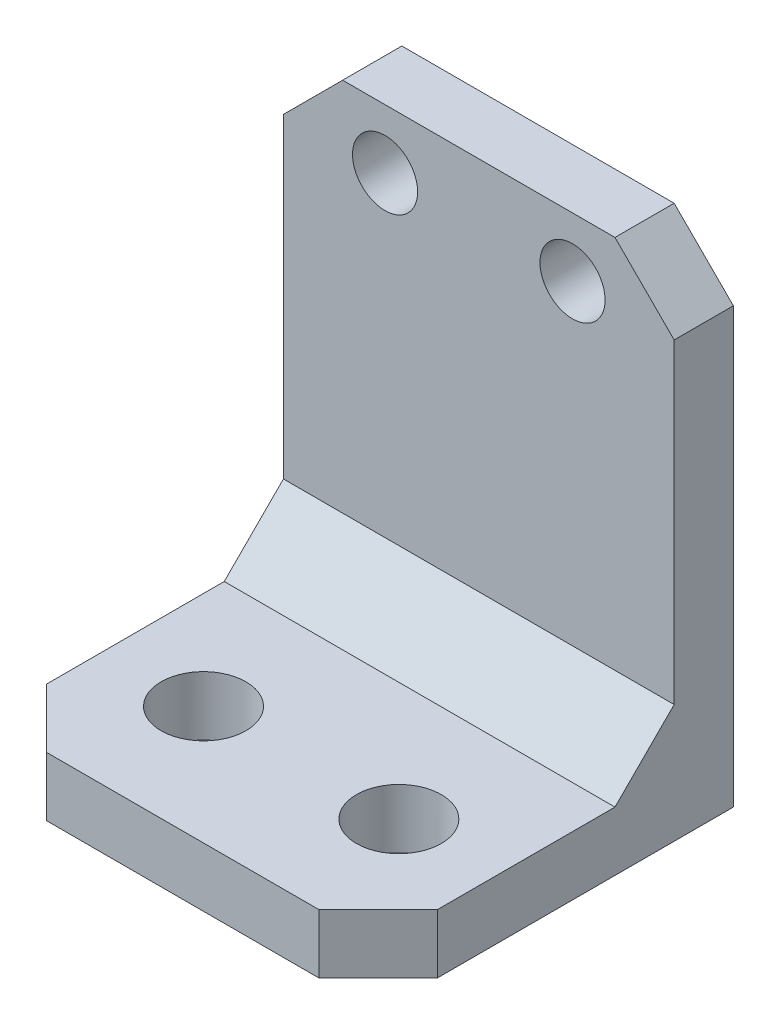
ISO-10303-21;
HEADER;
FILE_DESCRIPTION(('STEP AP214'),'2;1');
FILE_NAME('part.step','',(''),(''),'','','');
FILE_SCHEMA(('AUTOMOTIVE_DESIGN { 1 0 10303 214 1 1 1 1 }'));
ENDSEC;
DATA;
#1=APPLICATION_CONTEXT('core data for automotive mechanical design processes');
#2=APPLICATION_PROTOCOL_DEFINITION('international standard','automotive_design',2000,#1);
#3=PRODUCT_CONTEXT('',#1,'mechanical');
#4=PRODUCT('Part','Part','',(#3));
#5=PRODUCT_RELATED_PRODUCT_CATEGORY('part','',(#4));
#6=PRODUCT_DEFINITION_FORMATION('','',#4);
#7=PRODUCT_DEFINITION_CONTEXT('part definition',#1,'design');
#8=PRODUCT_DEFINITION('design','',#6,#7);
#9=PRODUCT_DEFINITION_SHAPE('','',#8);
#10=(LENGTH_UNIT() NAMED_UNIT(*) SI_UNIT(.MILLI.,.METRE.));
#11=(NAMED_UNIT(*) PLANE_ANGLE_UNIT() SI_UNIT($,.RADIAN.));
#12=(NAMED_UNIT(*) SI_UNIT($,.STERADIAN.) SOLID_ANGLE_UNIT());
#13=UNCERTAINTY_MEASURE_WITH_UNIT(LENGTH_MEASURE(1.E-05),#10,'distance_accuracy_value','');
#14=(GEOMETRIC_REPRESENTATION_CONTEXT(3) GLOBAL_UNCERTAINTY_ASSIGNED_CONTEXT((#13)) GLOBAL_UNIT_ASSIGNED_CONTEXT((#10,
#11,#12)) REPRESENTATION_CONTEXT('',''));
#15=CARTESIAN_POINT('',(0.,0.,0.));
#16=DIRECTION('',(0.,0.,1.));
#17=DIRECTION('',(1.,0.,0.));
#18=AXIS2_PLACEMENT_3D('',#15,#16,#17);
#19=CARTESIAN_POINT('',(0.,0.,3.));
#20=DIRECTION('',(0.,0.,-1.));
#21=DIRECTION('',(-1.,0.,0.));
#22=AXIS2_PLACEMENT_3D('',#19,#20,#21);
#23=PLANE('',#22);
#24=CARTESIAN_POINT('',(4.75,10.7876712328767,3.));
#25=DIRECTION('',(0.,0.,1.));
#26=DIRECTION('',(-1.,0.,0.));
#27=AXIS2_PLACEMENT_3D('',#24,#25,#26);
#28=CIRCLE('',#27,1.65);
#29=CARTESIAN_POINT('',(3.1,10.7876712328767,3.));
#30=VERTEX_POINT('',#29);
#31=EDGE_CURVE('E281',#30,#30,#28,.T.);
#32=ORIENTED_EDGE('',*,*,#31,.F.);
#33=EDGE_LOOP('',(#32));
#34=FACE_BOUND('',#33,.T.);
#35=CARTESIAN_POINT('',(-4.75,10.7876712328767,3.));
#36=DIRECTION('',(0.,0.,1.));
#37=DIRECTION('',(1.,0.,0.));
#38=AXIS2_PLACEMENT_3D('',#35,#36,#37);
#39=CIRCLE('',#38,1.65);
#40=CARTESIAN_POINT('',(-3.1,10.7876712328767,3.));
#41=VERTEX_POINT('',#40);
#42=EDGE_CURVE('E273',#41,#41,#39,.T.);
#43=ORIENTED_EDGE('',*,*,#42,.F.);
#44=EDGE_LOOP('',(#43));
#45=FACE_BOUND('',#44,.T.);
#46=DIRECTION('',(0.,1.,0.));
#47=VECTOR('',#46,1.);
#48=CARTESIAN_POINT('',(9.90000000000001,-11.2123287671233,3.));
#49=LINE('',#48,#47);
#50=CARTESIAN_POINT('',(9.90000000000001,-5.2123287671233,3.));
#51=VERTEX_POINT('',#50);
#52=CARTESIAN_POINT('',(9.9,10.7876712328767,3.));
#53=VERTEX_POINT('',#52);
#54=EDGE_CURVE('E146',#51,#53,#49,.T.);
#55=ORIENTED_EDGE('',*,*,#54,.T.);
#56=DIRECTION('',(0.707106781186547,-0.707106781186548,0.));
#57=VECTOR('',#56,1.);
#58=CARTESIAN_POINT('',(6.9,13.7876712328767,3.));
#59=LINE('',#58,#57);
#60=CARTESIAN_POINT('',(6.89999999999999,13.7876712328767,3.));
#61=VERTEX_POINT('',#60);
#62=EDGE_CURVE('E169',#53,#61,#59,.F.);
#63=ORIENTED_EDGE('',*,*,#62,.T.);
#64=DIRECTION('',(-1.,0.,0.));
#65=VECTOR('',#64,1.);
#66=CARTESIAN_POINT('',(-9.9,13.7876712328767,3.));
#67=LINE('',#66,#65);
#68=CARTESIAN_POINT('',(-6.89999999999999,13.7876712328767,3.));
#69=VERTEX_POINT('',#68);
#70=EDGE_CURVE('E149',#61,#69,#67,.T.);
#71=ORIENTED_EDGE('',*,*,#70,.T.);
#72=DIRECTION('',(0.707106781186549,0.707106781186546,0.));
#73=VECTOR('',#72,1.);
#74=CARTESIAN_POINT('',(-9.9,10.7876712328767,3.));
#75=LINE('',#74,#73);
#76=CARTESIAN_POINT('',(-9.9,10.7876712328767,3.));
#77=VERTEX_POINT('',#76);
#78=EDGE_CURVE('E167',#69,#77,#75,.F.);
#79=ORIENTED_EDGE('',*,*,#78,.T.);
#80=DIRECTION('',(0.,-1.,0.));
#81=VECTOR('',#80,1.);
#82=CARTESIAN_POINT('',(-9.9,-11.2123287671233,3.));
#83=LINE('',#82,#81);
#84=CARTESIAN_POINT('',(-9.9,-5.2123287671233,3.));
#85=VERTEX_POINT('',#84);
#86=EDGE_CURVE('E153',#77,#85,#83,.T.);
#87=ORIENTED_EDGE('',*,*,#86,.T.);
#88=DIRECTION('',(1.,0.,0.));
#89=VECTOR('',#88,1.);
#90=CARTESIAN_POINT('',(9.90000000000001,-5.2123287671233,3.));
#91=LINE('',#90,#89);
#92=EDGE_CURVE('E165',#85,#51,#91,.T.);
#93=ORIENTED_EDGE('',*,*,#92,.T.);
#94=EDGE_LOOP('',(#55,#63,#71,#79,#87,#93));
#95=FACE_BOUND('',#94,.T.);
#96=ADVANCED_FACE('F37',(#34,#45,#95),#23,.F.);
#97=CARTESIAN_POINT('',(0.,0.,0.));
#98=DIRECTION('',(0.,0.,-1.));
#99=DIRECTION('',(-1.,0.,0.));
#100=AXIS2_PLACEMENT_3D('',#97,#98,#99);
#101=PLANE('',#100);
#102=CARTESIAN_POINT('',(-4.75,10.7876712328767,0.));
#103=DIRECTION('',(0.,0.,1.));
#104=DIRECTION('',(1.,0.,0.));
#105=AXIS2_PLACEMENT_3D('',#102,#103,#104);
#106=CIRCLE('',#105,1.65);
#107=CARTESIAN_POINT('',(-3.1,10.7876712328767,0.));
#108=VERTEX_POINT('',#107);
#109=EDGE_CURVE('E278',#108,#108,#106,.T.);
#110=ORIENTED_EDGE('',*,*,#109,.T.);
#111=EDGE_LOOP('',(#110));
#112=FACE_BOUND('',#111,.T.);
#113=DIRECTION('',(-1.,0.,0.));
#114=VECTOR('',#113,1.);
#115=CARTESIAN_POINT('',(-9.9,13.7876712328767,0.));
#116=LINE('',#115,#114);
#117=CARTESIAN_POINT('',(6.89999999999999,13.7876712328767,0.));
#118=VERTEX_POINT('',#117);
#119=CARTESIAN_POINT('',(-6.89999999999999,13.7876712328767,0.));
#120=VERTEX_POINT('',#119);
#121=EDGE_CURVE('E139',#118,#120,#116,.T.);
#122=ORIENTED_EDGE('',*,*,#121,.F.);
#123=DIRECTION('',(-0.707106781186547,0.707106781186548,0.));
#124=VECTOR('',#123,1.);
#125=CARTESIAN_POINT('',(10.3438356164384,10.3438356164383,0.));
#126=LINE('',#125,#124);
#127=CARTESIAN_POINT('',(9.9,10.7876712328767,0.));
#128=VERTEX_POINT('',#127);
#129=EDGE_CURVE('E161',#118,#128,#126,.F.);
#130=ORIENTED_EDGE('',*,*,#129,.T.);
#131=DIRECTION('',(0.,1.,0.));
#132=VECTOR('',#131,1.);
#133=CARTESIAN_POINT('',(9.90000000000001,-11.2123287671233,0.));
#134=LINE('',#133,#132);
#135=CARTESIAN_POINT('',(9.90000000000001,-11.2123287671233,0.));
#136=VERTEX_POINT('',#135);
#137=EDGE_CURVE('E145',#136,#128,#134,.T.);
#138=ORIENTED_EDGE('',*,*,#137,.F.);
#139=DIRECTION('',(1.,0.,0.));
#140=VECTOR('',#139,1.);
#141=CARTESIAN_POINT('',(-9.9,-11.2123287671233,0.));
#142=LINE('',#141,#140);
#143=CARTESIAN_POINT('',(-9.9,-11.2123287671233,0.));
#144=VERTEX_POINT('',#143);
#145=EDGE_CURVE('E125',#144,#136,#142,.T.);
#146=ORIENTED_EDGE('',*,*,#145,.F.);
#147=DIRECTION('',(0.,-1.,0.));
#148=VECTOR('',#147,1.);
#149=CARTESIAN_POINT('',(-9.9,-11.2123287671233,0.));
#150=LINE('',#149,#148);
#151=CARTESIAN_POINT('',(-9.9,10.7876712328767,0.));
#152=VERTEX_POINT('',#151);
#153=EDGE_CURVE('E133',#152,#144,#150,.T.);
#154=ORIENTED_EDGE('',*,*,#153,.F.);
#155=DIRECTION('',(-0.707106781186549,-0.707106781186546,0.));
#156=VECTOR('',#155,1.);
#157=CARTESIAN_POINT('',(-10.3438356164383,10.3438356164384,0.));
#158=LINE('',#157,#156);
#159=EDGE_CURVE('E159',#152,#120,#158,.F.);
#160=ORIENTED_EDGE('',*,*,#159,.T.);
#161=EDGE_LOOP('',(#122,#130,#138,#146,#154,#160));
#162=FACE_BOUND('',#161,.T.);
#163=CARTESIAN_POINT('',(4.75,10.7876712328767,0.));
#164=DIRECTION('',(0.,0.,1.));
#165=DIRECTION('',(-1.,0.,0.));
#166=AXIS2_PLACEMENT_3D('',#163,#164,#165);
#167=CIRCLE('',#166,1.65);
#168=CARTESIAN_POINT('',(3.1,10.7876712328767,0.));
#169=VERTEX_POINT('',#168);
#170=EDGE_CURVE('E284',#169,#169,#167,.T.);
#171=ORIENTED_EDGE('',*,*,#170,.T.);
#172=EDGE_LOOP('',(#171));
#173=FACE_BOUND('',#172,.T.);
#174=ADVANCED_FACE('F142',(#112,#162,#173),#101,.T.);
#175=CARTESIAN_POINT('',(9.90000000000001,-11.2123287671233,3.));
#176=DIRECTION('',(-1.,0.,0.));
#177=DIRECTION('',(0.,-1.,0.));
#178=AXIS2_PLACEMENT_3D('',#175,#176,#177);
#179=PLANE('',#178);
#180=DIRECTION('',(0.,0.,-1.));
#181=VECTOR('',#180,1.);
#182=CARTESIAN_POINT('',(9.90000000000001,-8.21232876712329,18.));
#183=LINE('',#182,#181);
#184=CARTESIAN_POINT('',(9.90000000000001,-8.21232876712329,15.));
#185=VERTEX_POINT('',#184);
#186=CARTESIAN_POINT('',(9.90000000000001,-8.21232876712329,6.00000000000002));
#187=VERTEX_POINT('',#186);
#188=EDGE_CURVE('E262',#185,#187,#183,.T.);
#189=ORIENTED_EDGE('',*,*,#188,.F.);
#190=DIRECTION('',(0.,-1.,0.));
#191=VECTOR('',#190,1.);
#192=CARTESIAN_POINT('',(9.90000000000001,-11.2123287671233,15.));
#193=LINE('',#192,#191);
#194=CARTESIAN_POINT('',(9.90000000000001,-11.2123287671233,15.));
#195=VERTEX_POINT('',#194);
#196=EDGE_CURVE('E11',#185,#195,#193,.T.);
#197=ORIENTED_EDGE('',*,*,#196,.T.);
#198=DIRECTION('',(0.,0.,-1.));
#199=VECTOR('',#198,1.);
#200=CARTESIAN_POINT('',(9.90000000000001,-11.2123287671233,3.));
#201=LINE('',#200,#199);
#202=EDGE_CURVE('E129',#195,#136,#201,.T.);
#203=ORIENTED_EDGE('',*,*,#202,.T.);
#204=ORIENTED_EDGE('',*,*,#137,.T.);
#205=DIRECTION('',(0.,0.,1.));
#206=VECTOR('',#205,1.);
#207=CARTESIAN_POINT('',(9.9,10.7876712328767,3.));
#208=LINE('',#207,#206);
#209=EDGE_CURVE('E163',#128,#53,#208,.T.);
#210=ORIENTED_EDGE('',*,*,#209,.T.);
#211=ORIENTED_EDGE('',*,*,#54,.F.);
#212=DIRECTION('',(0.,0.707106781186544,-0.707106781186551));
#213=VECTOR('',#212,1.);
#214=CARTESIAN_POINT('',(9.90000000000001,-8.21232876712326,5.99999999999999));
#215=LINE('',#214,#213);
#216=EDGE_CURVE('E177',#51,#187,#215,.F.);
#217=ORIENTED_EDGE('',*,*,#216,.T.);
#218=EDGE_LOOP('',(#189,#197,#203,#204,#210,#211,#217));
#219=FACE_BOUND('',#218,.T.);
#220=ADVANCED_FACE('F221',(#219),#179,.F.);
#221=CARTESIAN_POINT('',(-9.9,13.7876712328767,3.));
#222=DIRECTION('',(0.,-1.,0.));
#223=DIRECTION('',(0.,0.,-1.));
#224=AXIS2_PLACEMENT_3D('',#221,#222,#223);
#225=PLANE('',#224);
#226=ORIENTED_EDGE('',*,*,#70,.F.);
#227=DIRECTION('',(0.,0.,-1.));
#228=VECTOR('',#227,1.);
#229=CARTESIAN_POINT('',(6.9,13.7876712328767,3.));
#230=LINE('',#229,#228);
#231=EDGE_CURVE('E156',#61,#118,#230,.T.);
#232=ORIENTED_EDGE('',*,*,#231,.T.);
#233=ORIENTED_EDGE('',*,*,#121,.T.);
#234=DIRECTION('',(0.,0.,1.));
#235=VECTOR('',#234,1.);
#236=CARTESIAN_POINT('',(-6.89999999999999,13.7876712328767,3.));
#237=LINE('',#236,#235);
#238=EDGE_CURVE('E128',#120,#69,#237,.T.);
#239=ORIENTED_EDGE('',*,*,#238,.T.);
#240=EDGE_LOOP('',(#226,#232,#233,#239));
#241=FACE_BOUND('',#240,.T.);
#242=ADVANCED_FACE('F235',(#241),#225,.F.);
#243=CARTESIAN_POINT('',(-9.9,-11.2123287671233,3.));
#244=DIRECTION('',(1.,0.,0.));
#245=DIRECTION('',(0.,1.,0.));
#246=AXIS2_PLACEMENT_3D('',#243,#244,#245);
#247=PLANE('',#246);
#248=DIRECTION('',(0.,0.,-1.));
#249=VECTOR('',#248,1.);
#250=CARTESIAN_POINT('',(-9.9,-11.2123287671233,3.));
#251=LINE('',#250,#249);
#252=CARTESIAN_POINT('',(-9.9,-11.2123287671233,15.));
#253=VERTEX_POINT('',#252);
#254=EDGE_CURVE('E119',#253,#144,#251,.T.);
#255=ORIENTED_EDGE('',*,*,#254,.F.);
#256=DIRECTION('',(0.,1.,0.));
#257=VECTOR('',#256,1.);
#258=CARTESIAN_POINT('',(-9.9,-11.2123287671233,15.));
#259=LINE('',#258,#257);
#260=CARTESIAN_POINT('',(-9.9,-8.21232876712329,15.));
#261=VERTEX_POINT('',#260);
#262=EDGE_CURVE('E60',#253,#261,#259,.T.);
#263=ORIENTED_EDGE('',*,*,#262,.T.);
#264=DIRECTION('',(0.,0.,-1.));
#265=VECTOR('',#264,1.);
#266=CARTESIAN_POINT('',(-9.9,-8.21232876712329,18.));
#267=LINE('',#266,#265);
#268=CARTESIAN_POINT('',(-9.9,-8.21232876712329,6.00000000000002));
#269=VERTEX_POINT('',#268);
#270=EDGE_CURVE('E194',#261,#269,#267,.T.);
#271=ORIENTED_EDGE('',*,*,#270,.T.);
#272=DIRECTION('',(0.,-0.707106781186544,0.707106781186551));
#273=VECTOR('',#272,1.);
#274=CARTESIAN_POINT('',(-9.9,-8.21232876712327,5.99999999999999));
#275=LINE('',#274,#273);
#276=EDGE_CURVE('E175',#269,#85,#275,.F.);
#277=ORIENTED_EDGE('',*,*,#276,.T.);
#278=ORIENTED_EDGE('',*,*,#86,.F.);
#279=DIRECTION('',(0.,0.,-1.));
#280=VECTOR('',#279,1.);
#281=CARTESIAN_POINT('',(-9.9,10.7876712328767,3.));
#282=LINE('',#281,#280);
#283=EDGE_CURVE('E137',#77,#152,#282,.T.);
#284=ORIENTED_EDGE('',*,*,#283,.T.);
#285=ORIENTED_EDGE('',*,*,#153,.T.);
#286=EDGE_LOOP('',(#255,#263,#271,#277,#278,#284,#285));
#287=FACE_BOUND('',#286,.T.);
#288=ADVANCED_FACE('F134',(#287),#247,.F.);
#289=CARTESIAN_POINT('',(-9.9,-11.2123287671233,3.));
#290=DIRECTION('',(0.,1.,0.));
#291=DIRECTION('',(-1.,0.,0.));
#292=AXIS2_PLACEMENT_3D('',#289,#290,#291);
#293=PLANE('',#292);
#294=CARTESIAN_POINT('',(4.95000000000001,-11.2123287671233,12.));
#295=DIRECTION('',(0.,1.,0.));
#296=DIRECTION('',(-1.,0.,0.));
#297=AXIS2_PLACEMENT_3D('',#294,#295,#296);
#298=CIRCLE('',#297,2.15);
#299=CARTESIAN_POINT('',(2.80000000000001,-11.2123287671233,12.));
#300=VERTEX_POINT('',#299);
#301=EDGE_CURVE('E292',#300,#300,#298,.T.);
#302=ORIENTED_EDGE('',*,*,#301,.T.);
#303=EDGE_LOOP('',(#302));
#304=FACE_BOUND('',#303,.T.);
#305=CARTESIAN_POINT('',(-4.94999999999999,-11.2123287671233,12.));
#306=DIRECTION('',(0.,1.,0.));
#307=DIRECTION('',(-1.,0.,0.));
#308=AXIS2_PLACEMENT_3D('',#305,#306,#307);
#309=CIRCLE('',#308,2.15);
#310=CARTESIAN_POINT('',(-7.09999999999999,-11.2123287671233,12.));
#311=VERTEX_POINT('',#310);
#312=EDGE_CURVE('E295',#311,#311,#309,.T.);
#313=ORIENTED_EDGE('',*,*,#312,.T.);
#314=EDGE_LOOP('',(#313));
#315=FACE_BOUND('',#314,.T.);
#316=DIRECTION('',(1.,0.,0.));
#317=VECTOR('',#316,1.);
#318=CARTESIAN_POINT('',(-9.9,-11.2123287671233,18.));
#319=LINE('',#318,#317);
#320=CARTESIAN_POINT('',(-6.9,-11.2123287671233,18.));
#321=VERTEX_POINT('',#320);
#322=CARTESIAN_POINT('',(6.90000000000001,-11.2123287671233,18.));
#323=VERTEX_POINT('',#322);
#324=EDGE_CURVE('E201',#321,#323,#319,.T.);
#325=ORIENTED_EDGE('',*,*,#324,.F.);
#326=DIRECTION('',(0.707106781186546,0.,0.707106781186549));
#327=VECTOR('',#326,1.);
#328=CARTESIAN_POINT('',(-6.9,-11.2123287671233,18.));
#329=LINE('',#328,#327);
#330=EDGE_CURVE('E127',#321,#253,#329,.F.);
#331=ORIENTED_EDGE('',*,*,#330,.T.);
#332=ORIENTED_EDGE('',*,*,#254,.T.);
#333=ORIENTED_EDGE('',*,*,#145,.T.);
#334=ORIENTED_EDGE('',*,*,#202,.F.);
#335=DIRECTION('',(0.707106781186546,0.,-0.707106781186549));
#336=VECTOR('',#335,1.);
#337=CARTESIAN_POINT('',(6.90000000000001,-11.2123287671233,18.));
#338=LINE('',#337,#336);
#339=EDGE_CURVE('E186',#195,#323,#338,.F.);
#340=ORIENTED_EDGE('',*,*,#339,.T.);
#341=EDGE_LOOP('',(#325,#331,#332,#333,#334,#340));
#342=FACE_BOUND('',#341,.T.);
#343=ADVANCED_FACE('F122',(#304,#315,#342),#293,.F.);
#344=CARTESIAN_POINT('',(-4.75,10.7876712328767,3.));
#345=DIRECTION('',(0.,0.,-1.));
#346=DIRECTION('',(-1.,0.,0.));
#347=AXIS2_PLACEMENT_3D('',#344,#345,#346);
#348=CYLINDRICAL_SURFACE('',#347,1.65);
#349=ORIENTED_EDGE('',*,*,#42,.T.);
#350=EDGE_LOOP('',(#349));
#351=FACE_BOUND('',#350,.T.);
#352=ORIENTED_EDGE('',*,*,#109,.F.);
#353=EDGE_LOOP('',(#352));
#354=FACE_BOUND('',#353,.T.);
#355=ADVANCED_FACE('F227',(#351,#354),#348,.F.);
#356=CARTESIAN_POINT('',(4.75,10.7876712328767,3.));
#357=DIRECTION('',(0.,0.,-1.));
#358=DIRECTION('',(-1.,0.,0.));
#359=AXIS2_PLACEMENT_3D('',#356,#357,#358);
#360=CYLINDRICAL_SURFACE('',#359,1.65);
#361=ORIENTED_EDGE('',*,*,#31,.T.);
#362=EDGE_LOOP('',(#361));
#363=FACE_BOUND('',#362,.T.);
#364=ORIENTED_EDGE('',*,*,#170,.F.);
#365=EDGE_LOOP('',(#364));
#366=FACE_BOUND('',#365,.T.);
#367=ADVANCED_FACE('F308',(#363,#366),#360,.F.);
#368=CARTESIAN_POINT('',(-9.9,-8.21232876712329,18.));
#369=DIRECTION('',(0.,-1.,0.));
#370=DIRECTION('',(0.,0.,-1.));
#371=AXIS2_PLACEMENT_3D('',#368,#369,#370);
#372=PLANE('',#371);
#373=CARTESIAN_POINT('',(4.95000000000001,-8.21232876712329,12.));
#374=DIRECTION('',(0.,1.,0.));
#375=DIRECTION('',(0.,0.,1.));
#376=AXIS2_PLACEMENT_3D('',#373,#374,#375);
#377=CIRCLE('',#376,2.15);
#378=CARTESIAN_POINT('',(4.95000000000001,-8.21232876712329,14.15));
#379=VERTEX_POINT('',#378);
#380=EDGE_CURVE('E298',#379,#379,#377,.T.);
#381=ORIENTED_EDGE('',*,*,#380,.F.);
#382=EDGE_LOOP('',(#381));
#383=FACE_BOUND('',#382,.T.);
#384=CARTESIAN_POINT('',(-4.94999999999999,-8.21232876712329,12.));
#385=DIRECTION('',(0.,1.,0.));
#386=DIRECTION('',(0.,0.,-1.));
#387=AXIS2_PLACEMENT_3D('',#384,#385,#386);
#388=CIRCLE('',#387,2.15);
#389=CARTESIAN_POINT('',(-4.94999999999999,-8.21232876712329,9.85000000000001));
#390=VERTEX_POINT('',#389);
#391=EDGE_CURVE('E299',#390,#390,#388,.T.);
#392=ORIENTED_EDGE('',*,*,#391,.F.);
#393=EDGE_LOOP('',(#392));
#394=FACE_BOUND('',#393,.T.);
#395=ORIENTED_EDGE('',*,*,#270,.F.);
#396=DIRECTION('',(-0.707106781186546,0.,-0.707106781186549));
#397=VECTOR('',#396,1.);
#398=CARTESIAN_POINT('',(-6.9,-8.21232876712329,18.));
#399=LINE('',#398,#397);
#400=CARTESIAN_POINT('',(-6.9,-8.21232876712329,18.));
#401=VERTEX_POINT('',#400);
#402=EDGE_CURVE('E45',#261,#401,#399,.F.);
#403=ORIENTED_EDGE('',*,*,#402,.T.);
#404=DIRECTION('',(-1.,0.,0.));
#405=VECTOR('',#404,1.);
#406=CARTESIAN_POINT('',(-9.9,-8.21232876712329,18.));
#407=LINE('',#406,#405);
#408=CARTESIAN_POINT('',(6.90000000000001,-8.21232876712329,18.));
#409=VERTEX_POINT('',#408);
#410=EDGE_CURVE('E193',#409,#401,#407,.T.);
#411=ORIENTED_EDGE('',*,*,#410,.F.);
#412=DIRECTION('',(-0.707106781186546,0.,0.707106781186549));
#413=VECTOR('',#412,1.);
#414=CARTESIAN_POINT('',(6.90000000000001,-8.21232876712329,18.));
#415=LINE('',#414,#413);
#416=EDGE_CURVE('E52',#409,#185,#415,.F.);
#417=ORIENTED_EDGE('',*,*,#416,.T.);
#418=ORIENTED_EDGE('',*,*,#188,.T.);
#419=DIRECTION('',(-1.,0.,0.));
#420=VECTOR('',#419,1.);
#421=CARTESIAN_POINT('',(-9.9,-8.21232876712329,6.00000000000002));
#422=LINE('',#421,#420);
#423=EDGE_CURVE('E172',#187,#269,#422,.T.);
#424=ORIENTED_EDGE('',*,*,#423,.T.);
#425=EDGE_LOOP('',(#395,#403,#411,#417,#418,#424));
#426=FACE_BOUND('',#425,.T.);
#427=ADVANCED_FACE('F192',(#383,#394,#426),#372,.F.);
#428=CARTESIAN_POINT('',(0.,0.,18.));
#429=DIRECTION('',(0.,0.,-1.));
#430=DIRECTION('',(-1.,0.,0.));
#431=AXIS2_PLACEMENT_3D('',#428,#429,#430);
#432=PLANE('',#431);
#433=ORIENTED_EDGE('',*,*,#410,.T.);
#434=DIRECTION('',(0.,-1.,0.));
#435=VECTOR('',#434,1.);
#436=CARTESIAN_POINT('',(-6.9,0.,18.));
#437=LINE('',#436,#435);
#438=EDGE_CURVE('E183',#401,#321,#437,.T.);
#439=ORIENTED_EDGE('',*,*,#438,.T.);
#440=ORIENTED_EDGE('',*,*,#324,.T.);
#441=DIRECTION('',(0.,1.,0.));
#442=VECTOR('',#441,1.);
#443=CARTESIAN_POINT('',(6.90000000000001,0.,18.));
#444=LINE('',#443,#442);
#445=EDGE_CURVE('E180',#323,#409,#444,.T.);
#446=ORIENTED_EDGE('',*,*,#445,.T.);
#447=EDGE_LOOP('',(#433,#439,#440,#446));
#448=FACE_BOUND('',#447,.T.);
#449=ADVANCED_FACE('F198',(#448),#432,.F.);
#450=CARTESIAN_POINT('',(6.9,13.7876712328767,3.));
#451=DIRECTION('',(-0.707106781186548,-0.707106781186547,0.));
#452=DIRECTION('',(0.,0.,-1.));
#453=AXIS2_PLACEMENT_3D('',#450,#451,#452);
#454=PLANE('',#453);
#455=ORIENTED_EDGE('',*,*,#62,.F.);
#456=ORIENTED_EDGE('',*,*,#209,.F.);
#457=ORIENTED_EDGE('',*,*,#129,.F.);
#458=ORIENTED_EDGE('',*,*,#231,.F.);
#459=EDGE_LOOP('',(#455,#456,#457,#458));
#460=FACE_BOUND('',#459,.T.);
#461=ADVANCED_FACE('F242',(#460),#454,.F.);
#462=CARTESIAN_POINT('',(-9.9,10.7876712328767,3.));
#463=DIRECTION('',(0.707106781186546,-0.707106781186549,0.));
#464=DIRECTION('',(0.,0.,-1.));
#465=AXIS2_PLACEMENT_3D('',#462,#463,#464);
#466=PLANE('',#465);
#467=ORIENTED_EDGE('',*,*,#78,.F.);
#468=ORIENTED_EDGE('',*,*,#238,.F.);
#469=ORIENTED_EDGE('',*,*,#159,.F.);
#470=ORIENTED_EDGE('',*,*,#283,.F.);
#471=EDGE_LOOP('',(#467,#468,#469,#470));
#472=FACE_BOUND('',#471,.T.);
#473=ADVANCED_FACE('F245',(#472),#466,.F.);
#474=CARTESIAN_POINT('',(-9.9,-8.21232876712329,6.00000000000002));
#475=DIRECTION('',(0.,0.707106781186551,0.707106781186544));
#476=DIRECTION('',(1.,0.,0.));
#477=AXIS2_PLACEMENT_3D('',#474,#475,#476);
#478=PLANE('',#477);
#479=ORIENTED_EDGE('',*,*,#216,.F.);
#480=ORIENTED_EDGE('',*,*,#92,.F.);
#481=ORIENTED_EDGE('',*,*,#276,.F.);
#482=ORIENTED_EDGE('',*,*,#423,.F.);
#483=EDGE_LOOP('',(#479,#480,#481,#482));
#484=FACE_BOUND('',#483,.T.);
#485=ADVANCED_FACE('F248',(#484),#478,.T.);
#486=CARTESIAN_POINT('',(-4.94999999999999,-23.2123287671233,12.));
#487=DIRECTION('',(0.,1.,0.));
#488=DIRECTION('',(0.,0.,1.));
#489=AXIS2_PLACEMENT_3D('',#486,#487,#488);
#490=CYLINDRICAL_SURFACE('',#489,2.15);
#491=ORIENTED_EDGE('',*,*,#391,.T.);
#492=EDGE_LOOP('',(#491));
#493=FACE_BOUND('',#492,.T.);
#494=ORIENTED_EDGE('',*,*,#312,.F.);
#495=EDGE_LOOP('',(#494));
#496=FACE_BOUND('',#495,.T.);
#497=ADVANCED_FACE('F211',(#493,#496),#490,.F.);
#498=CARTESIAN_POINT('',(4.95000000000001,-23.2123287671233,12.));
#499=DIRECTION('',(0.,1.,0.));
#500=DIRECTION('',(0.,0.,1.));
#501=AXIS2_PLACEMENT_3D('',#498,#499,#500);
#502=CYLINDRICAL_SURFACE('',#501,2.15);
#503=ORIENTED_EDGE('',*,*,#380,.T.);
#504=EDGE_LOOP('',(#503));
#505=FACE_BOUND('',#504,.T.);
#506=ORIENTED_EDGE('',*,*,#301,.F.);
#507=EDGE_LOOP('',(#506));
#508=FACE_BOUND('',#507,.T.);
#509=ADVANCED_FACE('F205',(#505,#508),#502,.F.);
#510=CARTESIAN_POINT('',(-6.9,0.,18.));
#511=DIRECTION('',(0.707106781186549,0.,-0.707106781186546));
#512=DIRECTION('',(0.,-1.,0.));
#513=AXIS2_PLACEMENT_3D('',#510,#511,#512);
#514=PLANE('',#513);
#515=ORIENTED_EDGE('',*,*,#402,.F.);
#516=ORIENTED_EDGE('',*,*,#262,.F.);
#517=ORIENTED_EDGE('',*,*,#330,.F.);
#518=ORIENTED_EDGE('',*,*,#438,.F.);
#519=EDGE_LOOP('',(#515,#516,#517,#518));
#520=FACE_BOUND('',#519,.T.);
#521=ADVANCED_FACE('F203',(#520),#514,.F.);
#522=CARTESIAN_POINT('',(6.90000000000001,0.,18.));
#523=DIRECTION('',(-0.707106781186549,0.,-0.707106781186546));
#524=DIRECTION('',(0.,1.,0.));
#525=AXIS2_PLACEMENT_3D('',#522,#523,#524);
#526=PLANE('',#525);
#527=ORIENTED_EDGE('',*,*,#339,.F.);
#528=ORIENTED_EDGE('',*,*,#196,.F.);
#529=ORIENTED_EDGE('',*,*,#416,.F.);
#530=ORIENTED_EDGE('',*,*,#445,.F.);
#531=EDGE_LOOP('',(#527,#528,#529,#530));
#532=FACE_BOUND('',#531,.T.);
#533=ADVANCED_FACE('F39',(#532),#526,.F.);
#534=CLOSED_SHELL('',(#96,#174,#220,#242,#288,#343,#355,#367,#427,#449,#461,#473,#485,#497,#509,
#521,#533));
#535=MANIFOLD_SOLID_BREP('B2',#534);
#536=ADVANCED_BREP_SHAPE_REPRESENTATION('',(#18,#535),#14);
#537=SHAPE_DEFINITION_REPRESENTATION(#9,#536);
ENDSEC;
END-ISO-10303-21;
